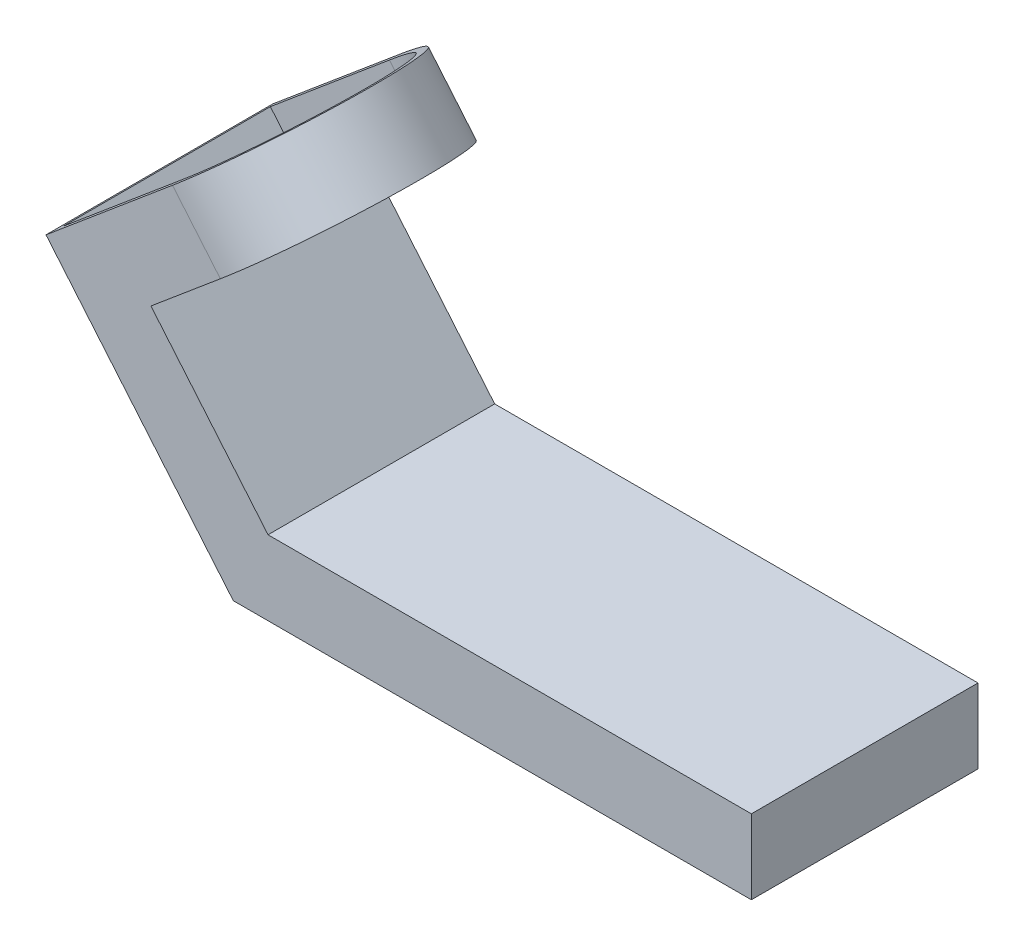
ISO-10303-21;
HEADER;
FILE_DESCRIPTION(('STEP AP214'),'2;1');
FILE_NAME('part.step','',(''),(''),'','','');
FILE_SCHEMA(('AUTOMOTIVE_DESIGN { 1 0 10303 214 1 1 1 1 }'));
ENDSEC;
DATA;
#1=APPLICATION_CONTEXT('core data for automotive mechanical design processes');
#2=APPLICATION_PROTOCOL_DEFINITION('international standard','automotive_design',2000,#1);
#3=PRODUCT_CONTEXT('',#1,'mechanical');
#4=PRODUCT('Part','Part','',(#3));
#5=PRODUCT_RELATED_PRODUCT_CATEGORY('part','',(#4));
#6=PRODUCT_DEFINITION_FORMATION('','',#4);
#7=PRODUCT_DEFINITION_CONTEXT('part definition',#1,'design');
#8=PRODUCT_DEFINITION('design','',#6,#7);
#9=PRODUCT_DEFINITION_SHAPE('','',#8);
#10=(LENGTH_UNIT() NAMED_UNIT(*) SI_UNIT(.MILLI.,.METRE.));
#11=(NAMED_UNIT(*) PLANE_ANGLE_UNIT() SI_UNIT($,.RADIAN.));
#12=(NAMED_UNIT(*) SI_UNIT($,.STERADIAN.) SOLID_ANGLE_UNIT());
#13=UNCERTAINTY_MEASURE_WITH_UNIT(LENGTH_MEASURE(1.E-05),#10,'distance_accuracy_value','');
#14=(GEOMETRIC_REPRESENTATION_CONTEXT(3) GLOBAL_UNCERTAINTY_ASSIGNED_CONTEXT((#13)) GLOBAL_UNIT_ASSIGNED_CONTEXT((#10,
#11,#12)) REPRESENTATION_CONTEXT('',''));
#15=CARTESIAN_POINT('',(0.,0.,0.));
#16=DIRECTION('',(0.,0.,1.));
#17=DIRECTION('',(1.,0.,0.));
#18=AXIS2_PLACEMENT_3D('',#15,#16,#17);
#19=CARTESIAN_POINT('',(-57.8508848717884,68.9439998807081,-70.));
#20=DIRECTION('',(-0.642787609686538,0.766044443118979,0.));
#21=DIRECTION('',(-0.766044443118979,-0.642787609686538,0.));
#22=AXIS2_PLACEMENT_3D('',#19,#20,#21);
#23=PLANE('',#22);
#24=DIRECTION('',(-0.766044443118979,-0.642787609686538,0.));
#25=VECTOR('',#24,1.);
#26=CARTESIAN_POINT('',(-57.8508848717884,68.9439998807081,0.));
#27=LINE('',#26,#25);
#28=CARTESIAN_POINT('',(-18.7826182727205,101.726167974722,0.));
#29=VERTEX_POINT('',#28);
#30=CARTESIAN_POINT('',(-57.8508848717884,68.9439998807081,0.));
#31=VERTEX_POINT('',#30);
#32=EDGE_CURVE('E184',#29,#31,#27,.T.);
#33=ORIENTED_EDGE('',*,*,#32,.F.);
#34=CARTESIAN_POINT('',(-18.7826182727205,101.726167974722,-35.));
#35=DIRECTION('',(-0.642787609686538,0.766044443118979,0.));
#36=DIRECTION('',(0.766044443118979,0.642787609686538,0.));
#37=AXIS2_PLACEMENT_3D('',#34,#35,#36);
#38=CIRCLE('',#37,35.);
#39=CARTESIAN_POINT('',(-18.7826182727205,101.726167974722,-70.));
#40=VERTEX_POINT('',#39);
#41=EDGE_CURVE('E209',#29,#40,#38,.T.);
#42=ORIENTED_EDGE('',*,*,#41,.T.);
#43=DIRECTION('',(-0.766044443118979,-0.642787609686538,0.));
#44=VECTOR('',#43,1.);
#45=CARTESIAN_POINT('',(-57.8508848717884,68.9439998807081,-70.));
#46=LINE('',#45,#44);
#47=CARTESIAN_POINT('',(-57.8508848717884,68.9439998807081,-70.));
#48=VERTEX_POINT('',#47);
#49=EDGE_CURVE('E155',#40,#48,#46,.T.);
#50=ORIENTED_EDGE('',*,*,#49,.T.);
#51=DIRECTION('',(0.,0.,1.));
#52=VECTOR('',#51,1.);
#53=CARTESIAN_POINT('',(-57.8508848717884,68.9439998807081,-70.));
#54=LINE('',#53,#52);
#55=EDGE_CURVE('E53',#48,#31,#54,.T.);
#56=ORIENTED_EDGE('',*,*,#55,.T.);
#57=EDGE_LOOP('',(#33,#42,#50,#56));
#58=FACE_BOUND('',#57,.T.);
#59=CARTESIAN_POINT('',(-18.7826182727205,101.726167974722,-35.));
#60=DIRECTION('',(-0.642787609686538,0.766044443118979,0.));
#61=DIRECTION('',(-0.766044443118979,-0.642787609686538,0.));
#62=AXIS2_PLACEMENT_3D('',#59,#60,#61);
#63=CIRCLE('',#62,32.);
#64=CARTESIAN_POINT('',(-18.7826182727205,101.726167974722,-3.));
#65=VERTEX_POINT('',#64);
#66=CARTESIAN_POINT('',(-18.7826182727205,101.726167974722,-67.));
#67=VERTEX_POINT('',#66);
#68=EDGE_CURVE('E228',#65,#67,#63,.T.);
#69=ORIENTED_EDGE('',*,*,#68,.F.);
#70=DIRECTION('',(-0.766044443118979,-0.642787609686538,0.));
#71=VECTOR('',#70,1.);
#72=CARTESIAN_POINT('',(-57.8508848717884,68.9439998807081,-3.));
#73=LINE('',#72,#71);
#74=CARTESIAN_POINT('',(-55.5527515424315,70.8723627097677,-3.));
#75=VERTEX_POINT('',#74);
#76=EDGE_CURVE('E237',#65,#75,#73,.T.);
#77=ORIENTED_EDGE('',*,*,#76,.T.);
#78=DIRECTION('',(0.,0.,1.));
#79=VECTOR('',#78,1.);
#80=CARTESIAN_POINT('',(-55.5527515424315,70.8723627097677,-70.));
#81=LINE('',#80,#79);
#82=CARTESIAN_POINT('',(-55.5527515424315,70.8723627097677,-67.));
#83=VERTEX_POINT('',#82);
#84=EDGE_CURVE('E243',#83,#75,#81,.T.);
#85=ORIENTED_EDGE('',*,*,#84,.F.);
#86=DIRECTION('',(-0.766044443118979,-0.642787609686538,0.));
#87=VECTOR('',#86,1.);
#88=CARTESIAN_POINT('',(-57.8508848717884,68.9439998807081,-67.));
#89=LINE('',#88,#87);
#90=EDGE_CURVE('E229',#67,#83,#89,.T.);
#91=ORIENTED_EDGE('',*,*,#90,.F.);
#92=EDGE_LOOP('',(#69,#77,#85,#91));
#93=FACE_BOUND('',#92,.T.);
#94=ADVANCED_FACE('F43',(#58,#93),#23,.T.);
#95=CARTESIAN_POINT('',(160.,0.,-70.));
#96=DIRECTION('',(0.,-1.,0.));
#97=DIRECTION('',(1.,0.,0.));
#98=AXIS2_PLACEMENT_3D('',#95,#96,#97);
#99=PLANE('',#98);
#100=DIRECTION('',(1.,0.,0.));
#101=VECTOR('',#100,1.);
#102=CARTESIAN_POINT('',(160.,0.,0.));
#103=LINE('',#102,#101);
#104=CARTESIAN_POINT('',(0.,0.,0.));
#105=VERTEX_POINT('',#104);
#106=CARTESIAN_POINT('',(160.,0.,0.));
#107=VERTEX_POINT('',#106);
#108=EDGE_CURVE('E162',#105,#107,#103,.T.);
#109=ORIENTED_EDGE('',*,*,#108,.F.);
#110=DIRECTION('',(0.,0.,1.));
#111=VECTOR('',#110,1.);
#112=CARTESIAN_POINT('',(0.,0.,-70.));
#113=LINE('',#112,#111);
#114=CARTESIAN_POINT('',(0.,0.,-70.));
#115=VERTEX_POINT('',#114);
#116=EDGE_CURVE('E11',#115,#105,#113,.T.);
#117=ORIENTED_EDGE('',*,*,#116,.F.);
#118=DIRECTION('',(1.,0.,0.));
#119=VECTOR('',#118,1.);
#120=CARTESIAN_POINT('',(160.,0.,-70.));
#121=LINE('',#120,#119);
#122=CARTESIAN_POINT('',(160.,0.,-70.));
#123=VERTEX_POINT('',#122);
#124=EDGE_CURVE('E191',#115,#123,#121,.T.);
#125=ORIENTED_EDGE('',*,*,#124,.T.);
#126=DIRECTION('',(0.,0.,1.));
#127=VECTOR('',#126,1.);
#128=CARTESIAN_POINT('',(160.,0.,-70.));
#129=LINE('',#128,#127);
#130=EDGE_CURVE('E47',#123,#107,#129,.T.);
#131=ORIENTED_EDGE('',*,*,#130,.T.);
#132=EDGE_LOOP('',(#109,#117,#125,#131));
#133=FACE_BOUND('',#132,.T.);
#134=ADVANCED_FACE('F45',(#133),#99,.T.);
#135=CARTESIAN_POINT('',(0.,0.,-70.));
#136=DIRECTION('',(-0.766044443118979,-0.642787609686538,0.));
#137=DIRECTION('',(0.642787609686538,-0.766044443118979,0.));
#138=AXIS2_PLACEMENT_3D('',#135,#136,#137);
#139=PLANE('',#138);
#140=DIRECTION('',(0.642787609686538,-0.766044443118979,0.));
#141=VECTOR('',#140,1.);
#142=CARTESIAN_POINT('',(0.,0.,0.));
#143=LINE('',#142,#141);
#144=EDGE_CURVE('E188',#31,#105,#143,.T.);
#145=ORIENTED_EDGE('',*,*,#144,.F.);
#146=ORIENTED_EDGE('',*,*,#55,.F.);
#147=DIRECTION('',(0.642787609686538,-0.766044443118979,0.));
#148=VECTOR('',#147,1.);
#149=CARTESIAN_POINT('',(0.,0.,-70.));
#150=LINE('',#149,#148);
#151=EDGE_CURVE('E159',#48,#115,#150,.T.);
#152=ORIENTED_EDGE('',*,*,#151,.T.);
#153=ORIENTED_EDGE('',*,*,#116,.T.);
#154=EDGE_LOOP('',(#145,#146,#152,#153));
#155=FACE_BOUND('',#154,.T.);
#156=ADVANCED_FACE('F204',(#155),#139,.T.);
#157=CARTESIAN_POINT('',(-3.99850324993012,84.1071457829851,-70.));
#158=DIRECTION('',(0.642787609686538,-0.766044443118979,0.));
#159=DIRECTION('',(0.766044443118979,0.642787609686538,0.));
#160=AXIS2_PLACEMENT_3D('',#157,#158,#159);
#161=PLANE('',#160);
#162=CARTESIAN_POINT('',(-3.9985032499301,84.1071457829851,-35.));
#163=DIRECTION('',(0.642787609686538,-0.766044443118979,0.));
#164=DIRECTION('',(0.766044443118979,0.642787609686538,0.));
#165=AXIS2_PLACEMENT_3D('',#162,#163,#164);
#166=CIRCLE('',#165,9.5);
#167=CARTESIAN_POINT('',(3.2789189597002,90.2136280750072,-35.));
#168=VERTEX_POINT('',#167);
#169=EDGE_CURVE('E216',#168,#168,#166,.F.);
#170=ORIENTED_EDGE('',*,*,#169,.T.);
#171=EDGE_LOOP('',(#170));
#172=FACE_BOUND('',#171,.T.);
#173=DIRECTION('',(0.766044443118979,0.642787609686538,0.));
#174=VECTOR('',#173,1.);
#175=CARTESIAN_POINT('',(-3.99850324993012,84.1071457829851,0.));
#176=LINE('',#175,#174);
#177=CARTESIAN_POINT('',(-25.4477476572615,66.109092711762,0.));
#178=VERTEX_POINT('',#177);
#179=CARTESIAN_POINT('',(-3.99850324993016,84.1071457829851,0.));
#180=VERTEX_POINT('',#179);
#181=EDGE_CURVE('E124',#178,#180,#176,.T.);
#182=ORIENTED_EDGE('',*,*,#181,.F.);
#183=DIRECTION('',(0.,0.,1.));
#184=VECTOR('',#183,1.);
#185=CARTESIAN_POINT('',(-25.4477476572615,66.109092711762,-70.));
#186=LINE('',#185,#184);
#187=CARTESIAN_POINT('',(-25.4477476572615,66.109092711762,-70.));
#188=VERTEX_POINT('',#187);
#189=EDGE_CURVE('E117',#188,#178,#186,.T.);
#190=ORIENTED_EDGE('',*,*,#189,.F.);
#191=DIRECTION('',(0.766044443118979,0.642787609686538,0.));
#192=VECTOR('',#191,1.);
#193=CARTESIAN_POINT('',(-3.99850324993012,84.1071457829851,-70.));
#194=LINE('',#193,#192);
#195=CARTESIAN_POINT('',(-3.99850324993013,84.1071457829851,-70.));
#196=VERTEX_POINT('',#195);
#197=EDGE_CURVE('E122',#188,#196,#194,.T.);
#198=ORIENTED_EDGE('',*,*,#197,.T.);
#199=CARTESIAN_POINT('',(-3.99850324993012,84.1071457829851,-35.));
#200=DIRECTION('',(-0.642787609686538,0.766044443118979,0.));
#201=DIRECTION('',(0.766044443118979,0.642787609686538,0.));
#202=AXIS2_PLACEMENT_3D('',#199,#200,#201);
#203=CIRCLE('',#202,35.);
#204=EDGE_CURVE('E167',#180,#196,#203,.T.);
#205=ORIENTED_EDGE('',*,*,#204,.F.);
#206=EDGE_LOOP('',(#182,#190,#198,#205));
#207=FACE_BOUND('',#206,.T.);
#208=ADVANCED_FACE('F119',(#172,#207),#161,.T.);
#209=CARTESIAN_POINT('',(-25.4477476572615,66.109092711762,-70.));
#210=DIRECTION('',(0.766044443118979,0.642787609686538,0.));
#211=DIRECTION('',(-0.642787609686538,0.766044443118979,0.));
#212=AXIS2_PLACEMENT_3D('',#209,#210,#211);
#213=PLANE('',#212);
#214=DIRECTION('',(-0.642787609686538,0.766044443118979,0.));
#215=VECTOR('',#214,1.);
#216=CARTESIAN_POINT('',(-25.4477476572615,66.109092711762,0.));
#217=LINE('',#216,#215);
#218=CARTESIAN_POINT('',(10.725076137565,23.,0.));
#219=VERTEX_POINT('',#218);
#220=EDGE_CURVE('E175',#219,#178,#217,.T.);
#221=ORIENTED_EDGE('',*,*,#220,.F.);
#222=DIRECTION('',(0.,0.,1.));
#223=VECTOR('',#222,1.);
#224=CARTESIAN_POINT('',(10.725076137565,23.,-70.));
#225=LINE('',#224,#223);
#226=CARTESIAN_POINT('',(10.725076137565,23.,-70.));
#227=VERTEX_POINT('',#226);
#228=EDGE_CURVE('E130',#227,#219,#225,.T.);
#229=ORIENTED_EDGE('',*,*,#228,.F.);
#230=DIRECTION('',(-0.642787609686538,0.766044443118979,0.));
#231=VECTOR('',#230,1.);
#232=CARTESIAN_POINT('',(-25.4477476572615,66.109092711762,-70.));
#233=LINE('',#232,#231);
#234=EDGE_CURVE('E137',#227,#188,#233,.T.);
#235=ORIENTED_EDGE('',*,*,#234,.T.);
#236=ORIENTED_EDGE('',*,*,#189,.T.);
#237=EDGE_LOOP('',(#221,#229,#235,#236));
#238=FACE_BOUND('',#237,.T.);
#239=ADVANCED_FACE('F144',(#238),#213,.T.);
#240=CARTESIAN_POINT('',(10.725076137565,23.,-70.));
#241=DIRECTION('',(0.,1.,0.));
#242=DIRECTION('',(-1.,0.,0.));
#243=AXIS2_PLACEMENT_3D('',#240,#241,#242);
#244=PLANE('',#243);
#245=DIRECTION('',(-1.,0.,0.));
#246=VECTOR('',#245,1.);
#247=CARTESIAN_POINT('',(10.725076137565,23.,0.));
#248=LINE('',#247,#246);
#249=CARTESIAN_POINT('',(160.,23.,0.));
#250=VERTEX_POINT('',#249);
#251=EDGE_CURVE('E171',#250,#219,#248,.T.);
#252=ORIENTED_EDGE('',*,*,#251,.F.);
#253=DIRECTION('',(0.,0.,1.));
#254=VECTOR('',#253,1.);
#255=CARTESIAN_POINT('',(160.,23.,-70.));
#256=LINE('',#255,#254);
#257=CARTESIAN_POINT('',(160.,23.,-70.));
#258=VERTEX_POINT('',#257);
#259=EDGE_CURVE('E196',#258,#250,#256,.T.);
#260=ORIENTED_EDGE('',*,*,#259,.F.);
#261=DIRECTION('',(-1.,0.,0.));
#262=VECTOR('',#261,1.);
#263=CARTESIAN_POINT('',(10.725076137565,23.,-70.));
#264=LINE('',#263,#262);
#265=EDGE_CURVE('E146',#258,#227,#264,.T.);
#266=ORIENTED_EDGE('',*,*,#265,.T.);
#267=ORIENTED_EDGE('',*,*,#228,.T.);
#268=EDGE_LOOP('',(#252,#260,#266,#267));
#269=FACE_BOUND('',#268,.T.);
#270=ADVANCED_FACE('F386',(#269),#244,.T.);
#271=CARTESIAN_POINT('',(160.,23.,-70.));
#272=DIRECTION('',(1.,0.,0.));
#273=DIRECTION('',(0.,0.,-1.));
#274=AXIS2_PLACEMENT_3D('',#271,#272,#273);
#275=PLANE('',#274);
#276=DIRECTION('',(0.,1.,0.));
#277=VECTOR('',#276,1.);
#278=CARTESIAN_POINT('',(160.,23.,0.));
#279=LINE('',#278,#277);
#280=EDGE_CURVE('E166',#107,#250,#279,.T.);
#281=ORIENTED_EDGE('',*,*,#280,.F.);
#282=ORIENTED_EDGE('',*,*,#130,.F.);
#283=DIRECTION('',(0.,1.,0.));
#284=VECTOR('',#283,1.);
#285=CARTESIAN_POINT('',(160.,23.,-70.));
#286=LINE('',#285,#284);
#287=EDGE_CURVE('E149',#123,#258,#286,.T.);
#288=ORIENTED_EDGE('',*,*,#287,.T.);
#289=ORIENTED_EDGE('',*,*,#259,.T.);
#290=EDGE_LOOP('',(#281,#282,#288,#289));
#291=FACE_BOUND('',#290,.T.);
#292=ADVANCED_FACE('F200',(#291),#275,.T.);
#293=CARTESIAN_POINT('',(0.,0.,-70.));
#294=DIRECTION('',(0.,0.,1.));
#295=DIRECTION('',(1.,0.,0.));
#296=AXIS2_PLACEMENT_3D('',#293,#294,#295);
#297=PLANE('',#296);
#298=ORIENTED_EDGE('',*,*,#124,.F.);
#299=ORIENTED_EDGE('',*,*,#151,.F.);
#300=ORIENTED_EDGE('',*,*,#49,.F.);
#301=DIRECTION('',(-0.642787609686538,0.766044443118979,0.));
#302=VECTOR('',#301,1.);
#303=CARTESIAN_POINT('',(-18.7826182727205,101.726167974722,-70.));
#304=LINE('',#303,#302);
#305=EDGE_CURVE('E141',#196,#40,#304,.T.);
#306=ORIENTED_EDGE('',*,*,#305,.F.);
#307=ORIENTED_EDGE('',*,*,#197,.F.);
#308=ORIENTED_EDGE('',*,*,#234,.F.);
#309=ORIENTED_EDGE('',*,*,#265,.F.);
#310=ORIENTED_EDGE('',*,*,#287,.F.);
#311=EDGE_LOOP('',(#298,#299,#300,#306,#307,#308,#309,#310));
#312=FACE_BOUND('',#311,.T.);
#313=ADVANCED_FACE('F135',(#312),#297,.F.);
#314=CARTESIAN_POINT('',(0.,0.,0.));
#315=DIRECTION('',(0.,0.,1.));
#316=DIRECTION('',(1.,0.,0.));
#317=AXIS2_PLACEMENT_3D('',#314,#315,#316);
#318=PLANE('',#317);
#319=ORIENTED_EDGE('',*,*,#108,.T.);
#320=ORIENTED_EDGE('',*,*,#280,.T.);
#321=ORIENTED_EDGE('',*,*,#251,.T.);
#322=ORIENTED_EDGE('',*,*,#220,.T.);
#323=ORIENTED_EDGE('',*,*,#181,.T.);
#324=DIRECTION('',(-0.642787609686538,0.766044443118979,0.));
#325=VECTOR('',#324,1.);
#326=CARTESIAN_POINT('',(-18.7826182727205,101.726167974722,0.));
#327=LINE('',#326,#325);
#328=EDGE_CURVE('E180',#180,#29,#327,.T.);
#329=ORIENTED_EDGE('',*,*,#328,.T.);
#330=ORIENTED_EDGE('',*,*,#32,.T.);
#331=ORIENTED_EDGE('',*,*,#144,.T.);
#332=EDGE_LOOP('',(#319,#320,#321,#322,#323,#329,#330,#331));
#333=FACE_BOUND('',#332,.T.);
#334=ADVANCED_FACE('F202',(#333),#318,.T.);
#335=CARTESIAN_POINT('',(-3.99850324993012,84.1071457829851,-35.));
#336=DIRECTION('',(-0.642787609686538,0.766044443118979,0.));
#337=DIRECTION('',(-0.766044443118979,-0.642787609686538,0.));
#338=AXIS2_PLACEMENT_3D('',#335,#336,#337);
#339=CYLINDRICAL_SURFACE('',#338,35.);
#340=ORIENTED_EDGE('',*,*,#41,.F.);
#341=ORIENTED_EDGE('',*,*,#328,.F.);
#342=ORIENTED_EDGE('',*,*,#204,.T.);
#343=ORIENTED_EDGE('',*,*,#305,.T.);
#344=EDGE_LOOP('',(#340,#341,#342,#343));
#345=FACE_BOUND('',#344,.T.);
#346=ADVANCED_FACE('F384',(#345),#339,.T.);
#347=CARTESIAN_POINT('',(105.177317965501,-46.0035313749285,-35.));
#348=DIRECTION('',(-0.642787609686538,0.766044443118979,0.));
#349=DIRECTION('',(-0.766044443118979,-0.642787609686538,0.));
#350=AXIS2_PLACEMENT_3D('',#347,#348,#349);
#351=CYLINDRICAL_SURFACE('',#350,9.5);
#352=CARTESIAN_POINT('',(-5.92686607898971,86.405279112342,-35.));
#353=DIRECTION('',(0.642787609686538,-0.766044443118979,0.));
#354=DIRECTION('',(0.766044443118979,0.642787609686538,0.));
#355=AXIS2_PLACEMENT_3D('',#352,#353,#354);
#356=CIRCLE('',#355,9.5);
#357=CARTESIAN_POINT('',(1.35055613064059,92.5117614043641,-35.));
#358=VERTEX_POINT('',#357);
#359=EDGE_CURVE('E224',#358,#358,#356,.F.);
#360=ORIENTED_EDGE('',*,*,#359,.T.);
#361=EDGE_LOOP('',(#360));
#362=FACE_BOUND('',#361,.T.);
#363=ORIENTED_EDGE('',*,*,#169,.F.);
#364=EDGE_LOOP('',(#363));
#365=FACE_BOUND('',#364,.T.);
#366=ADVANCED_FACE('F409',(#362,#365),#351,.F.);
#367=CARTESIAN_POINT('',(160.,3.,-70.));
#368=DIRECTION('',(0.,-1.,0.));
#369=DIRECTION('',(1.,0.,0.));
#370=AXIS2_PLACEMENT_3D('',#367,#368,#369);
#371=PLANE('',#370);
#372=DIRECTION('',(1.,0.,0.));
#373=VECTOR('',#372,1.);
#374=CARTESIAN_POINT('',(0.,3.,-3.));
#375=LINE('',#374,#373);
#376=CARTESIAN_POINT('',(1.398922974465,3.,-3.));
#377=VERTEX_POINT('',#376);
#378=CARTESIAN_POINT('',(157.,3.,-3.));
#379=VERTEX_POINT('',#378);
#380=EDGE_CURVE('E256',#377,#379,#375,.T.);
#381=ORIENTED_EDGE('',*,*,#380,.T.);
#382=DIRECTION('',(0.,0.,1.));
#383=VECTOR('',#382,1.);
#384=CARTESIAN_POINT('',(157.,3.,-70.));
#385=LINE('',#384,#383);
#386=CARTESIAN_POINT('',(157.,3.,-67.));
#387=VERTEX_POINT('',#386);
#388=EDGE_CURVE('E262',#387,#379,#385,.T.);
#389=ORIENTED_EDGE('',*,*,#388,.F.);
#390=DIRECTION('',(1.,0.,0.));
#391=VECTOR('',#390,1.);
#392=CARTESIAN_POINT('',(0.,3.,-67.));
#393=LINE('',#392,#391);
#394=CARTESIAN_POINT('',(1.398922974465,3.,-67.));
#395=VERTEX_POINT('',#394);
#396=EDGE_CURVE('E287',#395,#387,#393,.T.);
#397=ORIENTED_EDGE('',*,*,#396,.F.);
#398=DIRECTION('',(0.,0.,1.));
#399=VECTOR('',#398,1.);
#400=CARTESIAN_POINT('',(1.398922974465,3.,-70.));
#401=LINE('',#400,#399);
#402=EDGE_CURVE('E223',#395,#377,#401,.T.);
#403=ORIENTED_EDGE('',*,*,#402,.T.);
#404=EDGE_LOOP('',(#381,#389,#397,#403));
#405=FACE_BOUND('',#404,.T.);
#406=ADVANCED_FACE('F322',(#405),#371,.F.);
#407=CARTESIAN_POINT('',(2.29813332935694,1.92836282905961,-70.));
#408=DIRECTION('',(-0.766044443118979,-0.642787609686538,0.));
#409=DIRECTION('',(0.642787609686538,-0.766044443118979,0.));
#410=AXIS2_PLACEMENT_3D('',#407,#408,#409);
#411=PLANE('',#410);
#412=DIRECTION('',(0.642787609686538,-0.766044443118979,0.));
#413=VECTOR('',#412,1.);
#414=CARTESIAN_POINT('',(2.29813332935694,1.92836282905961,-3.));
#415=LINE('',#414,#413);
#416=EDGE_CURVE('E241',#75,#377,#415,.T.);
#417=ORIENTED_EDGE('',*,*,#416,.T.);
#418=ORIENTED_EDGE('',*,*,#402,.F.);
#419=DIRECTION('',(0.642787609686538,-0.766044443118979,0.));
#420=VECTOR('',#419,1.);
#421=CARTESIAN_POINT('',(2.29813332935694,1.92836282905961,-67.));
#422=LINE('',#421,#420);
#423=EDGE_CURVE('E61',#83,#395,#422,.T.);
#424=ORIENTED_EDGE('',*,*,#423,.F.);
#425=ORIENTED_EDGE('',*,*,#84,.T.);
#426=EDGE_LOOP('',(#417,#418,#424,#425));
#427=FACE_BOUND('',#426,.T.);
#428=ADVANCED_FACE('F338',(#427),#411,.F.);
#429=CARTESIAN_POINT('',(-5.92686607898973,86.405279112342,-70.));
#430=DIRECTION('',(0.642787609686538,-0.766044443118979,0.));
#431=DIRECTION('',(0.766044443118979,0.642787609686538,0.));
#432=AXIS2_PLACEMENT_3D('',#429,#430,#431);
#433=PLANE('',#432);
#434=ORIENTED_EDGE('',*,*,#359,.F.);
#435=EDGE_LOOP('',(#434));
#436=FACE_BOUND('',#435,.T.);
#437=DIRECTION('',(0.766044443118979,0.642787609686538,0.));
#438=VECTOR('',#437,1.);
#439=CARTESIAN_POINT('',(-44.9951326780577,53.6231110183286,-3.));
#440=LINE('',#439,#438);
#441=CARTESIAN_POINT('',(-29.6742438156781,66.4788632120593,-3.));
#442=VERTEX_POINT('',#441);
#443=CARTESIAN_POINT('',(-5.92686607898974,86.405279112342,-3.));
#444=VERTEX_POINT('',#443);
#445=EDGE_CURVE('E250',#442,#444,#440,.T.);
#446=ORIENTED_EDGE('',*,*,#445,.T.);
#447=CARTESIAN_POINT('',(-5.92686607898972,86.405279112342,-35.));
#448=DIRECTION('',(0.642787609686538,-0.766044443118979,0.));
#449=DIRECTION('',(0.766044443118979,0.642787609686538,0.));
#450=AXIS2_PLACEMENT_3D('',#447,#448,#449);
#451=CIRCLE('',#450,32.);
#452=CARTESIAN_POINT('',(-5.92686607898972,86.405279112342,-67.));
#453=VERTEX_POINT('',#452);
#454=EDGE_CURVE('E236',#444,#453,#451,.F.);
#455=ORIENTED_EDGE('',*,*,#454,.T.);
#456=DIRECTION('',(0.766044443118979,0.642787609686538,0.));
#457=VECTOR('',#456,1.);
#458=CARTESIAN_POINT('',(-44.9951326780577,53.6231110183286,-67.));
#459=LINE('',#458,#457);
#460=CARTESIAN_POINT('',(-29.6742438156781,66.4788632120593,-67.));
#461=VERTEX_POINT('',#460);
#462=EDGE_CURVE('E295',#461,#453,#459,.T.);
#463=ORIENTED_EDGE('',*,*,#462,.F.);
#464=DIRECTION('',(0.,0.,1.));
#465=VECTOR('',#464,1.);
#466=CARTESIAN_POINT('',(-29.6742438156781,66.4788632120593,-70.));
#467=LINE('',#466,#465);
#468=EDGE_CURVE('E246',#461,#442,#467,.T.);
#469=ORIENTED_EDGE('',*,*,#468,.T.);
#470=EDGE_LOOP('',(#446,#455,#463,#469));
#471=FACE_BOUND('',#470,.T.);
#472=ADVANCED_FACE('F358',(#436,#471),#433,.F.);
#473=CARTESIAN_POINT('',(-27.7458809866185,64.1807298827024,-70.));
#474=DIRECTION('',(0.766044443118979,0.642787609686538,0.));
#475=DIRECTION('',(-0.642787609686538,0.766044443118979,0.));
#476=AXIS2_PLACEMENT_3D('',#473,#474,#475);
#477=PLANE('',#476);
#478=DIRECTION('',(-0.642787609686538,0.766044443118979,0.));
#479=VECTOR('',#478,1.);
#480=CARTESIAN_POINT('',(15.3208888623796,12.8557521937308,-3.));
#481=LINE('',#480,#479);
#482=CARTESIAN_POINT('',(9.32615316310001,20.,-3.));
#483=VERTEX_POINT('',#482);
#484=EDGE_CURVE('E266',#483,#442,#481,.T.);
#485=ORIENTED_EDGE('',*,*,#484,.T.);
#486=ORIENTED_EDGE('',*,*,#468,.F.);
#487=DIRECTION('',(-0.642787609686538,0.766044443118979,0.));
#488=VECTOR('',#487,1.);
#489=CARTESIAN_POINT('',(15.3208888623796,12.8557521937308,-67.));
#490=LINE('',#489,#488);
#491=CARTESIAN_POINT('',(9.32615316310001,20.,-67.));
#492=VERTEX_POINT('',#491);
#493=EDGE_CURVE('E291',#492,#461,#490,.T.);
#494=ORIENTED_EDGE('',*,*,#493,.F.);
#495=DIRECTION('',(0.,0.,1.));
#496=VECTOR('',#495,1.);
#497=CARTESIAN_POINT('',(9.32615316310002,20.,-70.));
#498=LINE('',#497,#496);
#499=EDGE_CURVE('E261',#492,#483,#498,.T.);
#500=ORIENTED_EDGE('',*,*,#499,.T.);
#501=EDGE_LOOP('',(#485,#486,#494,#500));
#502=FACE_BOUND('',#501,.T.);
#503=ADVANCED_FACE('F364',(#502),#477,.F.);
#504=CARTESIAN_POINT('',(10.725076137565,20.,-70.));
#505=DIRECTION('',(0.,1.,0.));
#506=DIRECTION('',(-1.,0.,0.));
#507=AXIS2_PLACEMENT_3D('',#504,#505,#506);
#508=PLANE('',#507);
#509=DIRECTION('',(-1.,0.,0.));
#510=VECTOR('',#509,1.);
#511=CARTESIAN_POINT('',(0.,20.,-3.));
#512=LINE('',#511,#510);
#513=CARTESIAN_POINT('',(157.,20.,-3.));
#514=VERTEX_POINT('',#513);
#515=EDGE_CURVE('E255',#514,#483,#512,.T.);
#516=ORIENTED_EDGE('',*,*,#515,.T.);
#517=ORIENTED_EDGE('',*,*,#499,.F.);
#518=DIRECTION('',(-1.,0.,0.));
#519=VECTOR('',#518,1.);
#520=CARTESIAN_POINT('',(0.,20.,-67.));
#521=LINE('',#520,#519);
#522=CARTESIAN_POINT('',(157.,20.,-67.));
#523=VERTEX_POINT('',#522);
#524=EDGE_CURVE('E286',#523,#492,#521,.T.);
#525=ORIENTED_EDGE('',*,*,#524,.F.);
#526=DIRECTION('',(0.,0.,1.));
#527=VECTOR('',#526,1.);
#528=CARTESIAN_POINT('',(157.,20.,-70.));
#529=LINE('',#528,#527);
#530=EDGE_CURVE('E257',#523,#514,#529,.T.);
#531=ORIENTED_EDGE('',*,*,#530,.T.);
#532=EDGE_LOOP('',(#516,#517,#525,#531));
#533=FACE_BOUND('',#532,.T.);
#534=ADVANCED_FACE('F372',(#533),#508,.F.);
#535=CARTESIAN_POINT('',(157.,23.,-70.));
#536=DIRECTION('',(1.,0.,0.));
#537=DIRECTION('',(0.,0.,-1.));
#538=AXIS2_PLACEMENT_3D('',#535,#536,#537);
#539=PLANE('',#538);
#540=DIRECTION('',(0.,1.,0.));
#541=VECTOR('',#540,1.);
#542=CARTESIAN_POINT('',(157.,0.,-3.));
#543=LINE('',#542,#541);
#544=EDGE_CURVE('E251',#379,#514,#543,.T.);
#545=ORIENTED_EDGE('',*,*,#544,.T.);
#546=ORIENTED_EDGE('',*,*,#530,.F.);
#547=DIRECTION('',(0.,1.,0.));
#548=VECTOR('',#547,1.);
#549=CARTESIAN_POINT('',(157.,0.,-67.));
#550=LINE('',#549,#548);
#551=EDGE_CURVE('E282',#387,#523,#550,.T.);
#552=ORIENTED_EDGE('',*,*,#551,.F.);
#553=ORIENTED_EDGE('',*,*,#388,.T.);
#554=EDGE_LOOP('',(#545,#546,#552,#553));
#555=FACE_BOUND('',#554,.T.);
#556=ADVANCED_FACE('F492',(#555),#539,.F.);
#557=CARTESIAN_POINT('',(0.,0.,-67.));
#558=DIRECTION('',(0.,0.,1.));
#559=DIRECTION('',(1.,0.,0.));
#560=AXIS2_PLACEMENT_3D('',#557,#558,#559);
#561=PLANE('',#560);
#562=ORIENTED_EDGE('',*,*,#396,.T.);
#563=ORIENTED_EDGE('',*,*,#551,.T.);
#564=ORIENTED_EDGE('',*,*,#524,.T.);
#565=ORIENTED_EDGE('',*,*,#493,.T.);
#566=ORIENTED_EDGE('',*,*,#462,.T.);
#567=DIRECTION('',(-0.642787609686538,0.766044443118979,0.));
#568=VECTOR('',#567,1.);
#569=CARTESIAN_POINT('',(-3.99850324993012,84.1071457829851,-67.));
#570=LINE('',#569,#568);
#571=EDGE_CURVE('E232',#453,#67,#570,.T.);
#572=ORIENTED_EDGE('',*,*,#571,.T.);
#573=ORIENTED_EDGE('',*,*,#90,.T.);
#574=ORIENTED_EDGE('',*,*,#423,.T.);
#575=EDGE_LOOP('',(#562,#563,#564,#565,#566,#572,#573,#574));
#576=FACE_BOUND('',#575,.T.);
#577=ADVANCED_FACE('F502',(#576),#561,.T.);
#578=CARTESIAN_POINT('',(0.,0.,-3.));
#579=DIRECTION('',(0.,0.,1.));
#580=DIRECTION('',(1.,0.,0.));
#581=AXIS2_PLACEMENT_3D('',#578,#579,#580);
#582=PLANE('',#581);
#583=ORIENTED_EDGE('',*,*,#380,.F.);
#584=ORIENTED_EDGE('',*,*,#416,.F.);
#585=ORIENTED_EDGE('',*,*,#76,.F.);
#586=DIRECTION('',(-0.642787609686538,0.766044443118979,0.));
#587=VECTOR('',#586,1.);
#588=CARTESIAN_POINT('',(-3.99850324993013,84.1071457829851,-3.));
#589=LINE('',#588,#587);
#590=EDGE_CURVE('E242',#444,#65,#589,.T.);
#591=ORIENTED_EDGE('',*,*,#590,.F.);
#592=ORIENTED_EDGE('',*,*,#445,.F.);
#593=ORIENTED_EDGE('',*,*,#484,.F.);
#594=ORIENTED_EDGE('',*,*,#515,.F.);
#595=ORIENTED_EDGE('',*,*,#544,.F.);
#596=EDGE_LOOP('',(#583,#584,#585,#591,#592,#593,#594,#595));
#597=FACE_BOUND('',#596,.T.);
#598=ADVANCED_FACE('F333',(#597),#582,.F.);
#599=CARTESIAN_POINT('',(-3.99850324993012,84.1071457829851,-35.));
#600=DIRECTION('',(-0.642787609686538,0.766044443118979,0.));
#601=DIRECTION('',(-0.766044443118979,-0.642787609686538,0.));
#602=AXIS2_PLACEMENT_3D('',#599,#600,#601);
#603=CYLINDRICAL_SURFACE('',#602,32.);
#604=ORIENTED_EDGE('',*,*,#68,.T.);
#605=ORIENTED_EDGE('',*,*,#571,.F.);
#606=ORIENTED_EDGE('',*,*,#454,.F.);
#607=ORIENTED_EDGE('',*,*,#590,.T.);
#608=EDGE_LOOP('',(#604,#605,#606,#607));
#609=FACE_BOUND('',#608,.T.);
#610=ADVANCED_FACE('F352',(#609),#603,.F.);
#611=CLOSED_SHELL('',(#94,#134,#156,#208,#239,#270,#292,#313,#334,#346,#366,#406,#428,#472,#503,
#534,#556,#577,#598,#610));
#612=MANIFOLD_SOLID_BREP('B2',#611);
#613=ADVANCED_BREP_SHAPE_REPRESENTATION('',(#18,#612),#14);
#614=SHAPE_DEFINITION_REPRESENTATION(#9,#613);
ENDSEC;
END-ISO-10303-21;
